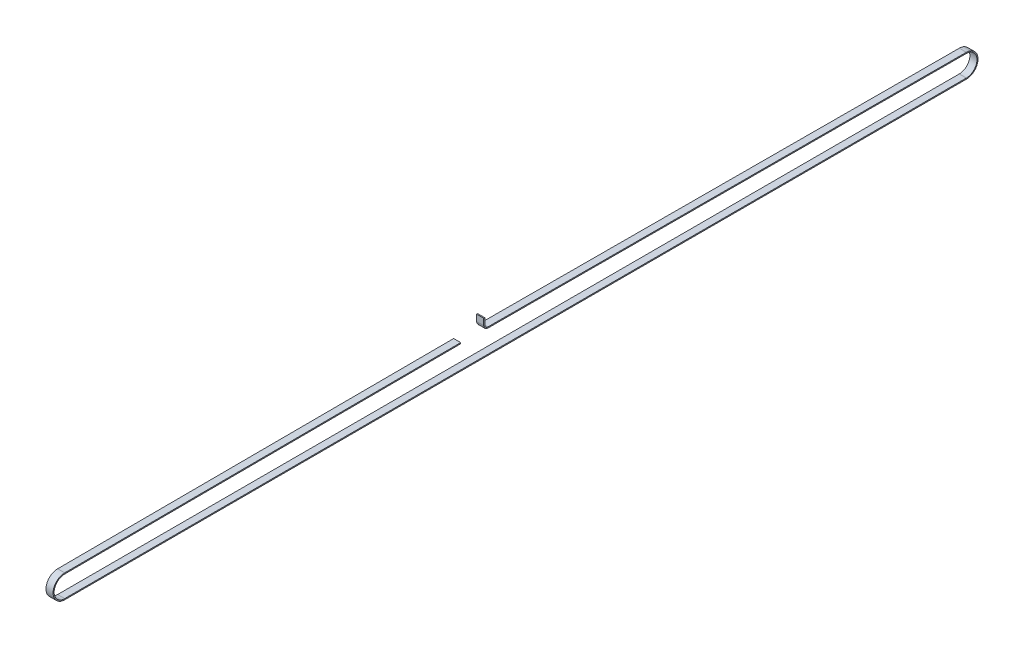
ISO-10303-21;
HEADER;
FILE_DESCRIPTION(('STEP AP214'),'2;1');
FILE_NAME('part.step','',(''),(''),'','','');
FILE_SCHEMA(('AUTOMOTIVE_DESIGN { 1 0 10303 214 1 1 1 1 }'));
ENDSEC;
DATA;
#1=APPLICATION_CONTEXT('core data for automotive mechanical design processes');
#2=APPLICATION_PROTOCOL_DEFINITION('international standard','automotive_design',2000,#1);
#3=PRODUCT_CONTEXT('',#1,'mechanical');
#4=PRODUCT('Part','Part','',(#3));
#5=PRODUCT_RELATED_PRODUCT_CATEGORY('part','',(#4));
#6=PRODUCT_DEFINITION_FORMATION('','',#4);
#7=PRODUCT_DEFINITION_CONTEXT('part definition',#1,'design');
#8=PRODUCT_DEFINITION('design','',#6,#7);
#9=PRODUCT_DEFINITION_SHAPE('','',#8);
#10=(LENGTH_UNIT() NAMED_UNIT(*) SI_UNIT(.MILLI.,.METRE.));
#11=(NAMED_UNIT(*) PLANE_ANGLE_UNIT() SI_UNIT($,.RADIAN.));
#12=(NAMED_UNIT(*) SI_UNIT($,.STERADIAN.) SOLID_ANGLE_UNIT());
#13=UNCERTAINTY_MEASURE_WITH_UNIT(LENGTH_MEASURE(1.E-05),#10,'distance_accuracy_value','');
#14=(GEOMETRIC_REPRESENTATION_CONTEXT(3) GLOBAL_UNCERTAINTY_ASSIGNED_CONTEXT((#13)) GLOBAL_UNIT_ASSIGNED_CONTEXT((#10,
#11,#12)) REPRESENTATION_CONTEXT('',''));
#15=CARTESIAN_POINT('',(0.,0.,0.));
#16=DIRECTION('',(0.,0.,1.));
#17=DIRECTION('',(1.,0.,0.));
#18=AXIS2_PLACEMENT_3D('',#15,#16,#17);
#19=CARTESIAN_POINT('',(5.,23.000012044913,43.5032181333647));
#20=DIRECTION('',(0.,0.,1.));
#21=DIRECTION('',(1.,0.,0.));
#22=AXIS2_PLACEMENT_3D('',#19,#20,#21);
#23=PLANE('',#22);
#24=DIRECTION('',(0.,1.,0.));
#25=VECTOR('',#24,1.);
#26=CARTESIAN_POINT('',(-5.,23.000012044913,43.5032181333647));
#27=LINE('',#26,#25);
#28=CARTESIAN_POINT('',(-5.,23.000012044913,43.5032181333647));
#29=VERTEX_POINT('',#28);
#30=CARTESIAN_POINT('',(-5.,32.0000382631837,43.5032181333647));
#31=VERTEX_POINT('',#30);
#32=EDGE_CURVE('E182',#29,#31,#27,.T.);
#33=ORIENTED_EDGE('',*,*,#32,.T.);
#34=DIRECTION('',(-1.,0.,0.));
#35=VECTOR('',#34,1.);
#36=CARTESIAN_POINT('',(5.,32.0000382631837,43.5032181333647));
#37=LINE('',#36,#35);
#38=CARTESIAN_POINT('',(5.,32.0000382631837,43.5032181333647));
#39=VERTEX_POINT('',#38);
#40=EDGE_CURVE('E11',#39,#31,#37,.T.);
#41=ORIENTED_EDGE('',*,*,#40,.F.);
#42=DIRECTION('',(0.,1.,0.));
#43=VECTOR('',#42,1.);
#44=CARTESIAN_POINT('',(5.,23.000012044913,43.5032181333647));
#45=LINE('',#44,#43);
#46=CARTESIAN_POINT('',(5.,23.000012044913,43.5032181333647));
#47=VERTEX_POINT('',#46);
#48=EDGE_CURVE('E119',#47,#39,#45,.T.);
#49=ORIENTED_EDGE('',*,*,#48,.F.);
#50=DIRECTION('',(-1.,0.,0.));
#51=VECTOR('',#50,1.);
#52=CARTESIAN_POINT('',(5.,23.000012044913,43.5032181333647));
#53=LINE('',#52,#51);
#54=EDGE_CURVE('E178',#47,#29,#53,.T.);
#55=ORIENTED_EDGE('',*,*,#54,.T.);
#56=EDGE_LOOP('',(#33,#41,#49,#55));
#57=FACE_BOUND('',#56,.T.);
#58=ADVANCED_FACE('F39',(#57),#23,.F.);
#59=CARTESIAN_POINT('',(5.,32.0000382631837,45.0032181333647));
#60=DIRECTION('',(0.,1.,0.));
#61=DIRECTION('',(0.,0.,1.));
#62=AXIS2_PLACEMENT_3D('',#59,#60,#61);
#63=PLANE('',#62);
#64=DIRECTION('',(0.,0.,-1.));
#65=VECTOR('',#64,1.);
#66=CARTESIAN_POINT('',(-5.,32.0000382631837,45.0032181333647));
#67=LINE('',#66,#65);
#68=CARTESIAN_POINT('',(-5.,32.0000382631837,45.0032181333647));
#69=VERTEX_POINT('',#68);
#70=EDGE_CURVE('E185',#69,#31,#67,.T.);
#71=ORIENTED_EDGE('',*,*,#70,.F.);
#72=DIRECTION('',(-1.,0.,0.));
#73=VECTOR('',#72,1.);
#74=CARTESIAN_POINT('',(5.,32.0000382631837,45.0032181333647));
#75=LINE('',#74,#73);
#76=CARTESIAN_POINT('',(5.,32.0000382631837,45.0032181333647));
#77=VERTEX_POINT('',#76);
#78=EDGE_CURVE('E47',#77,#69,#75,.T.);
#79=ORIENTED_EDGE('',*,*,#78,.F.);
#80=DIRECTION('',(0.,0.,-1.));
#81=VECTOR('',#80,1.);
#82=CARTESIAN_POINT('',(5.,32.0000382631837,45.0032181333647));
#83=LINE('',#82,#81);
#84=EDGE_CURVE('E267',#77,#39,#83,.T.);
#85=ORIENTED_EDGE('',*,*,#84,.T.);
#86=ORIENTED_EDGE('',*,*,#40,.T.);
#87=EDGE_LOOP('',(#71,#79,#85,#86));
#88=FACE_BOUND('',#87,.T.);
#89=ADVANCED_FACE('F254',(#88),#63,.T.);
#90=CARTESIAN_POINT('',(5.,23.000012044913,45.0032181333647));
#91=DIRECTION('',(0.,0.,1.));
#92=DIRECTION('',(1.,0.,0.));
#93=AXIS2_PLACEMENT_3D('',#90,#91,#92);
#94=PLANE('',#93);
#95=DIRECTION('',(0.,1.,0.));
#96=VECTOR('',#95,1.);
#97=CARTESIAN_POINT('',(-5.,23.000012044913,45.0032181333647));
#98=LINE('',#97,#96);
#99=CARTESIAN_POINT('',(-5.,23.000012044913,45.0032181333647));
#100=VERTEX_POINT('',#99);
#101=EDGE_CURVE('E188',#100,#69,#98,.T.);
#102=ORIENTED_EDGE('',*,*,#101,.F.);
#103=DIRECTION('',(-1.,0.,0.));
#104=VECTOR('',#103,1.);
#105=CARTESIAN_POINT('',(5.,23.000012044913,45.0032181333647));
#106=LINE('',#105,#104);
#107=CARTESIAN_POINT('',(5.,23.000012044913,45.0032181333647));
#108=VERTEX_POINT('',#107);
#109=EDGE_CURVE('E244',#108,#100,#106,.T.);
#110=ORIENTED_EDGE('',*,*,#109,.F.);
#111=DIRECTION('',(0.,1.,0.));
#112=VECTOR('',#111,1.);
#113=CARTESIAN_POINT('',(5.,23.000012044913,45.0032181333647));
#114=LINE('',#113,#112);
#115=EDGE_CURVE('E251',#108,#77,#114,.T.);
#116=ORIENTED_EDGE('',*,*,#115,.T.);
#117=ORIENTED_EDGE('',*,*,#78,.T.);
#118=EDGE_LOOP('',(#102,#110,#116,#117));
#119=FACE_BOUND('',#118,.T.);
#120=ADVANCED_FACE('F249',(#119),#94,.T.);
#121=CARTESIAN_POINT('',(5.,23.000012044913,39.0032181333647));
#122=DIRECTION('',(-1.,0.,0.));
#123=DIRECTION('',(0.,0.,1.));
#124=AXIS2_PLACEMENT_3D('',#121,#122,#123);
#125=CYLINDRICAL_SURFACE('',#124,6.);
#126=CARTESIAN_POINT('',(-5.,23.000012044913,39.0032181333647));
#127=DIRECTION('',(-1.,0.,0.));
#128=DIRECTION('',(0.,0.,1.));
#129=AXIS2_PLACEMENT_3D('',#126,#127,#128);
#130=CIRCLE('',#129,6.);
#131=CARTESIAN_POINT('',(-5.,17.0000382631837,39.0209556236342));
#132=VERTEX_POINT('',#131);
#133=EDGE_CURVE('E191',#132,#100,#130,.T.);
#134=ORIENTED_EDGE('',*,*,#133,.F.);
#135=DIRECTION('',(-1.,0.,0.));
#136=VECTOR('',#135,1.);
#137=CARTESIAN_POINT('',(5.,17.0000382631837,39.0209556236342));
#138=LINE('',#137,#136);
#139=CARTESIAN_POINT('',(5.,17.0000382631837,39.0209556236342));
#140=VERTEX_POINT('',#139);
#141=EDGE_CURVE('E242',#140,#132,#138,.T.);
#142=ORIENTED_EDGE('',*,*,#141,.F.);
#143=CARTESIAN_POINT('',(5.,23.000012044913,39.0032181333647));
#144=DIRECTION('',(-1.,0.,0.));
#145=DIRECTION('',(0.,0.,1.));
#146=AXIS2_PLACEMENT_3D('',#143,#144,#145);
#147=CIRCLE('',#146,6.);
#148=EDGE_CURVE('E264',#140,#108,#147,.T.);
#149=ORIENTED_EDGE('',*,*,#148,.T.);
#150=ORIENTED_EDGE('',*,*,#109,.T.);
#151=EDGE_LOOP('',(#134,#142,#149,#150));
#152=FACE_BOUND('',#151,.T.);
#153=ADVANCED_FACE('F261',(#152),#125,.T.);
#154=CARTESIAN_POINT('',(5.,14.9999344543232,-637.544343725674));
#155=DIRECTION('',(0.,-0.999995630288216,0.00295624837825238));
#156=DIRECTION('',(0.,-0.00295624837825238,-0.999995630288216));
#157=AXIS2_PLACEMENT_3D('',#154,#155,#156);
#158=PLANE('',#157);
#159=DIRECTION('',(0.,0.00295624837825238,0.999995630288216));
#160=VECTOR('',#159,1.);
#161=CARTESIAN_POINT('',(-5.,14.9999344543232,-637.544343725674));
#162=LINE('',#161,#160);
#163=CARTESIAN_POINT('',(-5.,14.9999344543233,-637.544343725674));
#164=VERTEX_POINT('',#163);
#165=EDGE_CURVE('E194',#164,#132,#162,.T.);
#166=ORIENTED_EDGE('',*,*,#165,.F.);
#167=DIRECTION('',(-1.,0.,0.));
#168=VECTOR('',#167,1.);
#169=CARTESIAN_POINT('',(5.,14.9999344543233,-637.544343725674));
#170=LINE('',#169,#168);
#171=CARTESIAN_POINT('',(5.,14.9999344543233,-637.544343725674));
#172=VERTEX_POINT('',#171);
#173=EDGE_CURVE('E240',#172,#164,#170,.T.);
#174=ORIENTED_EDGE('',*,*,#173,.F.);
#175=DIRECTION('',(0.,0.00295624837825238,0.999995630288216));
#176=VECTOR('',#175,1.);
#177=CARTESIAN_POINT('',(5.,14.9999344543232,-637.544343725674));
#178=LINE('',#177,#176);
#179=EDGE_CURVE('E269',#172,#140,#178,.T.);
#180=ORIENTED_EDGE('',*,*,#179,.T.);
#181=ORIENTED_EDGE('',*,*,#141,.T.);
#182=EDGE_LOOP('',(#166,#174,#180,#181));
#183=FACE_BOUND('',#182,.T.);
#184=ADVANCED_FACE('F326',(#183),#158,.T.);
#185=CARTESIAN_POINT('',(5.,0.,-637.5));
#186=DIRECTION('',(-1.,0.,0.));
#187=DIRECTION('',(0.,0.,1.));
#188=AXIS2_PLACEMENT_3D('',#185,#186,#187);
#189=CYLINDRICAL_SURFACE('',#188,15.);
#190=CARTESIAN_POINT('',(-5.,0.,-637.5));
#191=DIRECTION('',(1.,0.,0.));
#192=DIRECTION('',(0.,0.,-1.));
#193=AXIS2_PLACEMENT_3D('',#190,#191,#192);
#194=CIRCLE('',#193,15.);
#195=CARTESIAN_POINT('',(-5.,-15.,-637.5));
#196=VERTEX_POINT('',#195);
#197=EDGE_CURVE('E197',#196,#164,#194,.T.);
#198=ORIENTED_EDGE('',*,*,#197,.F.);
#199=DIRECTION('',(-1.,0.,0.));
#200=VECTOR('',#199,1.);
#201=CARTESIAN_POINT('',(5.,-15.,-637.5));
#202=LINE('',#201,#200);
#203=CARTESIAN_POINT('',(5.,-15.,-637.5));
#204=VERTEX_POINT('',#203);
#205=EDGE_CURVE('E238',#204,#196,#202,.T.);
#206=ORIENTED_EDGE('',*,*,#205,.F.);
#207=CARTESIAN_POINT('',(5.,0.,-637.5));
#208=DIRECTION('',(1.,0.,0.));
#209=DIRECTION('',(0.,0.,-1.));
#210=AXIS2_PLACEMENT_3D('',#207,#208,#209);
#211=CIRCLE('',#210,15.);
#212=EDGE_CURVE('E275',#204,#172,#211,.T.);
#213=ORIENTED_EDGE('',*,*,#212,.T.);
#214=ORIENTED_EDGE('',*,*,#173,.T.);
#215=EDGE_LOOP('',(#198,#206,#213,#214));
#216=FACE_BOUND('',#215,.T.);
#217=ADVANCED_FACE('F329',(#216),#189,.F.);
#218=CARTESIAN_POINT('',(5.,-15.,637.5));
#219=DIRECTION('',(0.,1.,0.));
#220=DIRECTION('',(0.,0.,1.));
#221=AXIS2_PLACEMENT_3D('',#218,#219,#220);
#222=PLANE('',#221);
#223=DIRECTION('',(0.,0.,-1.));
#224=VECTOR('',#223,1.);
#225=CARTESIAN_POINT('',(-5.,-15.,637.5));
#226=LINE('',#225,#224);
#227=CARTESIAN_POINT('',(-5.,-15.,637.5));
#228=VERTEX_POINT('',#227);
#229=EDGE_CURVE('E200',#228,#196,#226,.T.);
#230=ORIENTED_EDGE('',*,*,#229,.F.);
#231=DIRECTION('',(-1.,0.,0.));
#232=VECTOR('',#231,1.);
#233=CARTESIAN_POINT('',(5.,-15.,637.5));
#234=LINE('',#233,#232);
#235=CARTESIAN_POINT('',(5.,-15.,637.5));
#236=VERTEX_POINT('',#235);
#237=EDGE_CURVE('E236',#236,#228,#234,.T.);
#238=ORIENTED_EDGE('',*,*,#237,.F.);
#239=DIRECTION('',(0.,0.,-1.));
#240=VECTOR('',#239,1.);
#241=CARTESIAN_POINT('',(5.,-15.,637.5));
#242=LINE('',#241,#240);
#243=EDGE_CURVE('E278',#236,#204,#242,.T.);
#244=ORIENTED_EDGE('',*,*,#243,.T.);
#245=ORIENTED_EDGE('',*,*,#205,.T.);
#246=EDGE_LOOP('',(#230,#238,#244,#245));
#247=FACE_BOUND('',#246,.T.);
#248=ADVANCED_FACE('F333',(#247),#222,.T.);
#249=CARTESIAN_POINT('',(5.,0.,637.5));
#250=DIRECTION('',(-1.,0.,0.));
#251=DIRECTION('',(0.,0.,1.));
#252=AXIS2_PLACEMENT_3D('',#249,#250,#251);
#253=CYLINDRICAL_SURFACE('',#252,15.);
#254=CARTESIAN_POINT('',(-5.,0.,637.5));
#255=DIRECTION('',(1.,0.,0.));
#256=DIRECTION('',(0.,0.,-1.));
#257=AXIS2_PLACEMENT_3D('',#254,#255,#256);
#258=CIRCLE('',#257,15.);
#259=CARTESIAN_POINT('',(-5.,14.9999043420409,637.553569857417));
#260=VERTEX_POINT('',#259);
#261=EDGE_CURVE('E203',#260,#228,#258,.T.);
#262=ORIENTED_EDGE('',*,*,#261,.F.);
#263=DIRECTION('',(-1.,0.,0.));
#264=VECTOR('',#263,1.);
#265=CARTESIAN_POINT('',(5.,14.9999043420409,637.553569857417));
#266=LINE('',#265,#264);
#267=CARTESIAN_POINT('',(5.,14.9999043420409,637.553569857417));
#268=VERTEX_POINT('',#267);
#269=EDGE_CURVE('E234',#268,#260,#266,.T.);
#270=ORIENTED_EDGE('',*,*,#269,.F.);
#271=CARTESIAN_POINT('',(5.,0.,637.5));
#272=DIRECTION('',(1.,0.,0.));
#273=DIRECTION('',(0.,0.,-1.));
#274=AXIS2_PLACEMENT_3D('',#271,#272,#273);
#275=CIRCLE('',#274,15.);
#276=EDGE_CURVE('E281',#268,#236,#275,.T.);
#277=ORIENTED_EDGE('',*,*,#276,.T.);
#278=ORIENTED_EDGE('',*,*,#237,.T.);
#279=EDGE_LOOP('',(#262,#270,#277,#278));
#280=FACE_BOUND('',#279,.T.);
#281=ADVANCED_FACE('F337',(#280),#253,.F.);
#282=CARTESIAN_POINT('',(5.,14.9999043420409,637.553569857417));
#283=DIRECTION('',(0.,-0.999993622802724,-0.00357132382782558));
#284=DIRECTION('',(0.,0.00357132382782558,-0.999993622802724));
#285=AXIS2_PLACEMENT_3D('',#282,#283,#284);
#286=PLANE('',#285);
#287=DIRECTION('',(0.,-0.00357132382782559,0.999993622802724));
#288=VECTOR('',#287,1.);
#289=CARTESIAN_POINT('',(-5.,14.9999043420409,637.553569857417));
#290=LINE('',#289,#288);
#291=CARTESIAN_POINT('',(-5.,17.0000382631837,77.5032181333647));
#292=VERTEX_POINT('',#291);
#293=EDGE_CURVE('E206',#292,#260,#290,.T.);
#294=ORIENTED_EDGE('',*,*,#293,.F.);
#295=DIRECTION('',(-1.,0.,0.));
#296=VECTOR('',#295,1.);
#297=CARTESIAN_POINT('',(5.,17.0000382631837,77.5032181333647));
#298=LINE('',#297,#296);
#299=CARTESIAN_POINT('',(5.,17.0000382631837,77.5032181333647));
#300=VERTEX_POINT('',#299);
#301=EDGE_CURVE('E232',#300,#292,#298,.T.);
#302=ORIENTED_EDGE('',*,*,#301,.F.);
#303=DIRECTION('',(0.,-0.00357132382782559,0.999993622802724));
#304=VECTOR('',#303,1.);
#305=CARTESIAN_POINT('',(5.,14.9999043420409,637.553569857417));
#306=LINE('',#305,#304);
#307=EDGE_CURVE('E284',#300,#268,#306,.T.);
#308=ORIENTED_EDGE('',*,*,#307,.T.);
#309=ORIENTED_EDGE('',*,*,#269,.T.);
#310=EDGE_LOOP('',(#294,#302,#308,#309));
#311=FACE_BOUND('',#310,.T.);
#312=ADVANCED_FACE('F341',(#311),#286,.T.);
#313=CARTESIAN_POINT('',(5.,18.5000286973877,77.5085751191065));
#314=DIRECTION('',(0.,0.00357132382787044,-0.999993622802724));
#315=DIRECTION('',(0.,0.999993622802724,0.00357132382787044));
#316=AXIS2_PLACEMENT_3D('',#313,#314,#315);
#317=PLANE('',#316);
#318=DIRECTION('',(0.,-0.999993622802724,-0.00357132382787044));
#319=VECTOR('',#318,1.);
#320=CARTESIAN_POINT('',(-5.,18.5000286973877,77.5085751191065));
#321=LINE('',#320,#319);
#322=CARTESIAN_POINT('',(-5.,18.5000286973877,77.5085751191065));
#323=VERTEX_POINT('',#322);
#324=EDGE_CURVE('E209',#323,#292,#321,.T.);
#325=ORIENTED_EDGE('',*,*,#324,.F.);
#326=DIRECTION('',(-1.,0.,0.));
#327=VECTOR('',#326,1.);
#328=CARTESIAN_POINT('',(5.,18.5000286973877,77.5085751191065));
#329=LINE('',#328,#327);
#330=CARTESIAN_POINT('',(5.,18.5000286973877,77.5085751191065));
#331=VERTEX_POINT('',#330);
#332=EDGE_CURVE('E230',#331,#323,#329,.T.);
#333=ORIENTED_EDGE('',*,*,#332,.F.);
#334=DIRECTION('',(0.,-0.999993622802724,-0.00357132382787044));
#335=VECTOR('',#334,1.);
#336=CARTESIAN_POINT('',(5.,18.5000286973877,77.5085751191065));
#337=LINE('',#336,#335);
#338=EDGE_CURVE('E287',#331,#300,#337,.T.);
#339=ORIENTED_EDGE('',*,*,#338,.T.);
#340=ORIENTED_EDGE('',*,*,#301,.T.);
#341=EDGE_LOOP('',(#325,#333,#339,#340));
#342=FACE_BOUND('',#341,.T.);
#343=ADVANCED_FACE('F345',(#342),#317,.T.);
#344=CARTESIAN_POINT('',(5.,16.4998947762449,637.558926843159));
#345=DIRECTION('',(0.,-0.999993622802724,-0.00357132382782559));
#346=DIRECTION('',(0.,0.00357132382782559,-0.999993622802724));
#347=AXIS2_PLACEMENT_3D('',#344,#345,#346);
#348=PLANE('',#347);
#349=DIRECTION('',(0.,-0.00357132382782558,0.999993622802724));
#350=VECTOR('',#349,1.);
#351=CARTESIAN_POINT('',(-5.,16.4998947762449,637.558926843159));
#352=LINE('',#351,#350);
#353=CARTESIAN_POINT('',(-5.,16.499894776245,637.558926843159));
#354=VERTEX_POINT('',#353);
#355=EDGE_CURVE('E212',#323,#354,#352,.T.);
#356=ORIENTED_EDGE('',*,*,#355,.T.);
#357=DIRECTION('',(-1.,0.,0.));
#358=VECTOR('',#357,1.);
#359=CARTESIAN_POINT('',(5.,16.499894776245,637.558926843159));
#360=LINE('',#359,#358);
#361=CARTESIAN_POINT('',(5.,16.499894776245,637.558926843159));
#362=VERTEX_POINT('',#361);
#363=EDGE_CURVE('E227',#362,#354,#360,.T.);
#364=ORIENTED_EDGE('',*,*,#363,.F.);
#365=DIRECTION('',(0.,-0.00357132382782558,0.999993622802724));
#366=VECTOR('',#365,1.);
#367=CARTESIAN_POINT('',(5.,16.4998947762449,637.558926843159));
#368=LINE('',#367,#366);
#369=EDGE_CURVE('E290',#331,#362,#368,.T.);
#370=ORIENTED_EDGE('',*,*,#369,.F.);
#371=ORIENTED_EDGE('',*,*,#332,.T.);
#372=EDGE_LOOP('',(#356,#364,#370,#371));
#373=FACE_BOUND('',#372,.T.);
#374=ADVANCED_FACE('F349',(#373),#348,.F.);
#375=CARTESIAN_POINT('',(5.,0.,637.5));
#376=DIRECTION('',(-1.,0.,0.));
#377=DIRECTION('',(0.,0.,1.));
#378=AXIS2_PLACEMENT_3D('',#375,#376,#377);
#379=CYLINDRICAL_SURFACE('',#378,16.5);
#380=CARTESIAN_POINT('',(-5.,0.,637.5));
#381=DIRECTION('',(1.,0.,0.));
#382=DIRECTION('',(0.,0.,-1.));
#383=AXIS2_PLACEMENT_3D('',#380,#381,#382);
#384=CIRCLE('',#383,16.5);
#385=CARTESIAN_POINT('',(-5.,-16.5,637.5));
#386=VERTEX_POINT('',#385);
#387=EDGE_CURVE('E214',#354,#386,#384,.T.);
#388=ORIENTED_EDGE('',*,*,#387,.T.);
#389=DIRECTION('',(-1.,0.,0.));
#390=VECTOR('',#389,1.);
#391=CARTESIAN_POINT('',(5.,-16.5,637.5));
#392=LINE('',#391,#390);
#393=CARTESIAN_POINT('',(5.,-16.5,637.5));
#394=VERTEX_POINT('',#393);
#395=EDGE_CURVE('E224',#394,#386,#392,.T.);
#396=ORIENTED_EDGE('',*,*,#395,.F.);
#397=CARTESIAN_POINT('',(5.,0.,637.5));
#398=DIRECTION('',(1.,0.,0.));
#399=DIRECTION('',(0.,0.,-1.));
#400=AXIS2_PLACEMENT_3D('',#397,#398,#399);
#401=CIRCLE('',#400,16.5);
#402=EDGE_CURVE('E292',#362,#394,#401,.T.);
#403=ORIENTED_EDGE('',*,*,#402,.F.);
#404=ORIENTED_EDGE('',*,*,#363,.T.);
#405=EDGE_LOOP('',(#388,#396,#403,#404));
#406=FACE_BOUND('',#405,.T.);
#407=ADVANCED_FACE('F299',(#406),#379,.T.);
#408=CARTESIAN_POINT('',(5.,-16.5,637.5));
#409=DIRECTION('',(0.,1.,0.));
#410=DIRECTION('',(0.,0.,1.));
#411=AXIS2_PLACEMENT_3D('',#408,#409,#410);
#412=PLANE('',#411);
#413=DIRECTION('',(0.,0.,-1.));
#414=VECTOR('',#413,1.);
#415=CARTESIAN_POINT('',(-5.,-16.5,637.5));
#416=LINE('',#415,#414);
#417=CARTESIAN_POINT('',(-5.,-16.5,-637.5));
#418=VERTEX_POINT('',#417);
#419=EDGE_CURVE('E216',#386,#418,#416,.T.);
#420=ORIENTED_EDGE('',*,*,#419,.T.);
#421=DIRECTION('',(-1.,0.,0.));
#422=VECTOR('',#421,1.);
#423=CARTESIAN_POINT('',(5.,-16.5,-637.5));
#424=LINE('',#423,#422);
#425=CARTESIAN_POINT('',(5.,-16.5,-637.5));
#426=VERTEX_POINT('',#425);
#427=EDGE_CURVE('E173',#426,#418,#424,.T.);
#428=ORIENTED_EDGE('',*,*,#427,.F.);
#429=DIRECTION('',(0.,0.,-1.));
#430=VECTOR('',#429,1.);
#431=CARTESIAN_POINT('',(5.,-16.5,637.5));
#432=LINE('',#431,#430);
#433=EDGE_CURVE('E164',#394,#426,#432,.T.);
#434=ORIENTED_EDGE('',*,*,#433,.F.);
#435=ORIENTED_EDGE('',*,*,#395,.T.);
#436=EDGE_LOOP('',(#420,#428,#434,#435));
#437=FACE_BOUND('',#436,.T.);
#438=ADVANCED_FACE('F303',(#437),#412,.F.);
#439=CARTESIAN_POINT('',(5.,0.,-637.5));
#440=DIRECTION('',(-1.,0.,0.));
#441=DIRECTION('',(0.,0.,1.));
#442=AXIS2_PLACEMENT_3D('',#439,#440,#441);
#443=CYLINDRICAL_SURFACE('',#442,16.5);
#444=CARTESIAN_POINT('',(-5.,0.,-637.5));
#445=DIRECTION('',(1.,0.,0.));
#446=DIRECTION('',(0.,0.,-1.));
#447=AXIS2_PLACEMENT_3D('',#444,#445,#446);
#448=CIRCLE('',#447,16.5);
#449=CARTESIAN_POINT('',(-5.,16.4999278997556,-637.548778098241));
#450=VERTEX_POINT('',#449);
#451=EDGE_CURVE('E172',#418,#450,#448,.T.);
#452=ORIENTED_EDGE('',*,*,#451,.T.);
#453=DIRECTION('',(-1.,0.,0.));
#454=VECTOR('',#453,1.);
#455=CARTESIAN_POINT('',(5.,16.4999278997556,-637.548778098241));
#456=LINE('',#455,#454);
#457=CARTESIAN_POINT('',(5.,16.4999278997556,-637.548778098241));
#458=VERTEX_POINT('',#457);
#459=EDGE_CURVE('E169',#458,#450,#456,.T.);
#460=ORIENTED_EDGE('',*,*,#459,.F.);
#461=CARTESIAN_POINT('',(5.,0.,-637.5));
#462=DIRECTION('',(1.,0.,0.));
#463=DIRECTION('',(0.,0.,-1.));
#464=AXIS2_PLACEMENT_3D('',#461,#462,#463);
#465=CIRCLE('',#464,16.5);
#466=EDGE_CURVE('E158',#426,#458,#465,.T.);
#467=ORIENTED_EDGE('',*,*,#466,.F.);
#468=ORIENTED_EDGE('',*,*,#427,.T.);
#469=EDGE_LOOP('',(#452,#460,#467,#468));
#470=FACE_BOUND('',#469,.T.);
#471=ADVANCED_FACE('F170',(#470),#443,.T.);
#472=CARTESIAN_POINT('',(5.,16.4999278997556,-637.548778098241));
#473=DIRECTION('',(0.,-0.999995630288216,0.00295624837825238));
#474=DIRECTION('',(0.,-0.00295624837825238,-0.999995630288216));
#475=AXIS2_PLACEMENT_3D('',#472,#473,#474);
#476=PLANE('',#475);
#477=DIRECTION('',(0.,0.00295624837825238,0.999995630288216));
#478=VECTOR('',#477,1.);
#479=CARTESIAN_POINT('',(-5.,16.4999278997556,-637.548778098241));
#480=LINE('',#479,#478);
#481=CARTESIAN_POINT('',(-5.,18.500031708616,39.0165212510668));
#482=VERTEX_POINT('',#481);
#483=EDGE_CURVE('E107',#450,#482,#480,.T.);
#484=ORIENTED_EDGE('',*,*,#483,.T.);
#485=DIRECTION('',(-1.,0.,0.));
#486=VECTOR('',#485,1.);
#487=CARTESIAN_POINT('',(5.,18.500031708616,39.0165212510668));
#488=LINE('',#487,#486);
#489=CARTESIAN_POINT('',(5.,18.500031708616,39.0165212510668));
#490=VERTEX_POINT('',#489);
#491=EDGE_CURVE('E174',#490,#482,#488,.T.);
#492=ORIENTED_EDGE('',*,*,#491,.F.);
#493=DIRECTION('',(0.,0.00295624837825238,0.999995630288216));
#494=VECTOR('',#493,1.);
#495=CARTESIAN_POINT('',(5.,16.4999278997556,-637.548778098241));
#496=LINE('',#495,#494);
#497=EDGE_CURVE('E162',#458,#490,#496,.T.);
#498=ORIENTED_EDGE('',*,*,#497,.F.);
#499=ORIENTED_EDGE('',*,*,#459,.T.);
#500=EDGE_LOOP('',(#484,#492,#498,#499));
#501=FACE_BOUND('',#500,.T.);
#502=ADVANCED_FACE('F176',(#501),#476,.F.);
#503=CARTESIAN_POINT('',(5.,23.000012044913,39.0032181333647));
#504=DIRECTION('',(-1.,0.,0.));
#505=DIRECTION('',(0.,0.,1.));
#506=AXIS2_PLACEMENT_3D('',#503,#504,#505);
#507=CYLINDRICAL_SURFACE('',#506,4.5);
#508=CARTESIAN_POINT('',(-5.,23.000012044913,39.0032181333647));
#509=DIRECTION('',(1.,0.,0.));
#510=DIRECTION('',(0.,0.,-1.));
#511=AXIS2_PLACEMENT_3D('',#508,#509,#510);
#512=CIRCLE('',#511,4.5);
#513=EDGE_CURVE('E113',#482,#29,#512,.F.);
#514=ORIENTED_EDGE('',*,*,#513,.T.);
#515=ORIENTED_EDGE('',*,*,#54,.F.);
#516=CARTESIAN_POINT('',(5.,23.000012044913,39.0032181333647));
#517=DIRECTION('',(1.,0.,0.));
#518=DIRECTION('',(0.,0.,-1.));
#519=AXIS2_PLACEMENT_3D('',#516,#517,#518);
#520=CIRCLE('',#519,4.5);
#521=EDGE_CURVE('E55',#490,#47,#520,.F.);
#522=ORIENTED_EDGE('',*,*,#521,.F.);
#523=ORIENTED_EDGE('',*,*,#491,.T.);
#524=EDGE_LOOP('',(#514,#515,#522,#523));
#525=FACE_BOUND('',#524,.T.);
#526=ADVANCED_FACE('F305',(#525),#507,.F.);
#527=CARTESIAN_POINT('',(5.,23.000012044913,39.0032181333647));
#528=DIRECTION('',(-1.,0.,0.));
#529=DIRECTION('',(0.,0.,1.));
#530=AXIS2_PLACEMENT_3D('',#527,#528,#529);
#531=PLANE('',#530);
#532=ORIENTED_EDGE('',*,*,#48,.T.);
#533=ORIENTED_EDGE('',*,*,#84,.F.);
#534=ORIENTED_EDGE('',*,*,#115,.F.);
#535=ORIENTED_EDGE('',*,*,#148,.F.);
#536=ORIENTED_EDGE('',*,*,#179,.F.);
#537=ORIENTED_EDGE('',*,*,#212,.F.);
#538=ORIENTED_EDGE('',*,*,#243,.F.);
#539=ORIENTED_EDGE('',*,*,#276,.F.);
#540=ORIENTED_EDGE('',*,*,#307,.F.);
#541=ORIENTED_EDGE('',*,*,#338,.F.);
#542=ORIENTED_EDGE('',*,*,#369,.T.);
#543=ORIENTED_EDGE('',*,*,#402,.T.);
#544=ORIENTED_EDGE('',*,*,#433,.T.);
#545=ORIENTED_EDGE('',*,*,#466,.T.);
#546=ORIENTED_EDGE('',*,*,#497,.T.);
#547=ORIENTED_EDGE('',*,*,#521,.T.);
#548=EDGE_LOOP('',(#532,#533,#534,#535,#536,#537,#538,#539,#540,#541,#542,#543,#544,#545,#546,#547));
#549=FACE_BOUND('',#548,.T.);
#550=ADVANCED_FACE('F160',(#549),#531,.F.);
#551=CARTESIAN_POINT('',(-5.,23.000012044913,39.0032181333647));
#552=DIRECTION('',(-1.,0.,0.));
#553=DIRECTION('',(0.,0.,1.));
#554=AXIS2_PLACEMENT_3D('',#551,#552,#553);
#555=PLANE('',#554);
#556=ORIENTED_EDGE('',*,*,#32,.F.);
#557=ORIENTED_EDGE('',*,*,#513,.F.);
#558=ORIENTED_EDGE('',*,*,#483,.F.);
#559=ORIENTED_EDGE('',*,*,#451,.F.);
#560=ORIENTED_EDGE('',*,*,#419,.F.);
#561=ORIENTED_EDGE('',*,*,#387,.F.);
#562=ORIENTED_EDGE('',*,*,#355,.F.);
#563=ORIENTED_EDGE('',*,*,#324,.T.);
#564=ORIENTED_EDGE('',*,*,#293,.T.);
#565=ORIENTED_EDGE('',*,*,#261,.T.);
#566=ORIENTED_EDGE('',*,*,#229,.T.);
#567=ORIENTED_EDGE('',*,*,#197,.T.);
#568=ORIENTED_EDGE('',*,*,#165,.T.);
#569=ORIENTED_EDGE('',*,*,#133,.T.);
#570=ORIENTED_EDGE('',*,*,#101,.T.);
#571=ORIENTED_EDGE('',*,*,#70,.T.);
#572=EDGE_LOOP('',(#556,#557,#558,#559,#560,#561,#562,#563,#564,#565,#566,#567,#568,#569,#570,#571));
#573=FACE_BOUND('',#572,.T.);
#574=ADVANCED_FACE('F257',(#573),#555,.T.);
#575=CLOSED_SHELL('',(#58,#89,#120,#153,#184,#217,#248,#281,#312,#343,#374,#407,#438,#471,#502,
#526,#550,#574));
#576=MANIFOLD_SOLID_BREP('B2',#575);
#577=ADVANCED_BREP_SHAPE_REPRESENTATION('',(#18,#576),#14);
#578=SHAPE_DEFINITION_REPRESENTATION(#9,#577);
ENDSEC;
END-ISO-10303-21;
